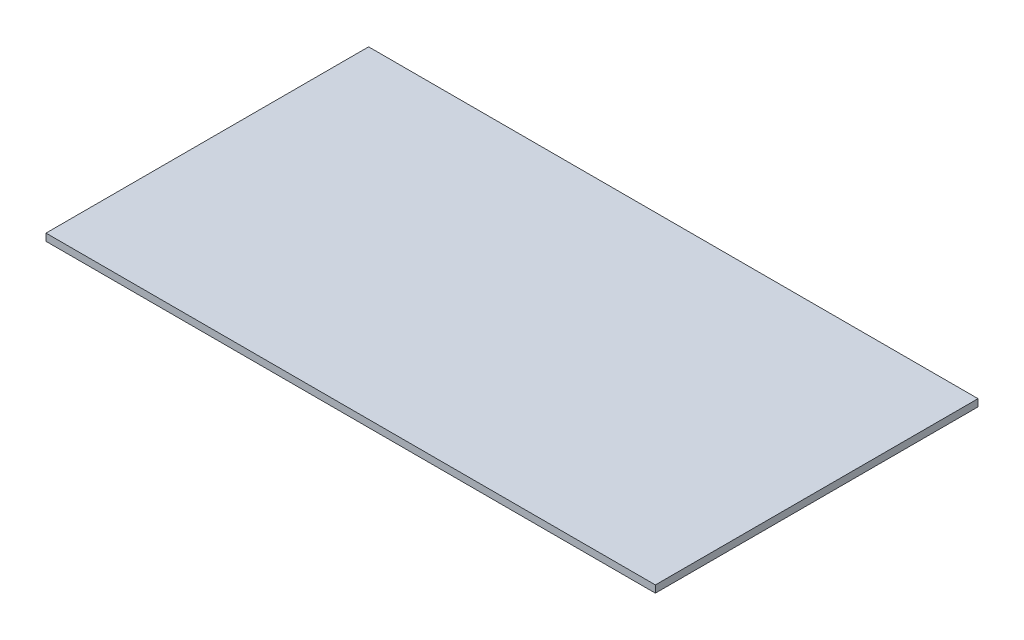
ISO-10303-21;
HEADER;
FILE_DESCRIPTION(('STEP AP214'),'2;1');
FILE_NAME('part.step','',(''),(''),'','','');
FILE_SCHEMA(('AUTOMOTIVE_DESIGN { 1 0 10303 214 1 1 1 1 }'));
ENDSEC;
DATA;
#1=APPLICATION_CONTEXT('core data for automotive mechanical design processes');
#2=APPLICATION_PROTOCOL_DEFINITION('international standard','automotive_design',2000,#1);
#3=PRODUCT_CONTEXT('',#1,'mechanical');
#4=PRODUCT('Part','Part','',(#3));
#5=PRODUCT_RELATED_PRODUCT_CATEGORY('part','',(#4));
#6=PRODUCT_DEFINITION_FORMATION('','',#4);
#7=PRODUCT_DEFINITION_CONTEXT('part definition',#1,'design');
#8=PRODUCT_DEFINITION('design','',#6,#7);
#9=PRODUCT_DEFINITION_SHAPE('','',#8);
#10=(LENGTH_UNIT() NAMED_UNIT(*) SI_UNIT(.MILLI.,.METRE.));
#11=(NAMED_UNIT(*) PLANE_ANGLE_UNIT() SI_UNIT($,.RADIAN.));
#12=(NAMED_UNIT(*) SI_UNIT($,.STERADIAN.) SOLID_ANGLE_UNIT());
#13=UNCERTAINTY_MEASURE_WITH_UNIT(LENGTH_MEASURE(1.E-05),#10,'distance_accuracy_value','');
#14=(GEOMETRIC_REPRESENTATION_CONTEXT(3) GLOBAL_UNCERTAINTY_ASSIGNED_CONTEXT((#13)) GLOBAL_UNIT_ASSIGNED_CONTEXT((#10,
#11,#12)) REPRESENTATION_CONTEXT('',''));
#15=CARTESIAN_POINT('',(0.,0.,0.));
#16=DIRECTION('',(0.,0.,1.));
#17=DIRECTION('',(1.,0.,0.));
#18=AXIS2_PLACEMENT_3D('',#15,#16,#17);
#19=CARTESIAN_POINT('',(-425.,10.,225.));
#20=DIRECTION('',(1.,0.,0.));
#21=DIRECTION('',(0.,0.,-1.));
#22=AXIS2_PLACEMENT_3D('',#19,#20,#21);
#23=PLANE('',#22);
#24=DIRECTION('',(0.,0.,1.));
#25=VECTOR('',#24,1.);
#26=CARTESIAN_POINT('',(-425.,0.,225.));
#27=LINE('',#26,#25);
#28=CARTESIAN_POINT('',(-425.,0.,-225.));
#29=VERTEX_POINT('',#28);
#30=CARTESIAN_POINT('',(-425.,0.,225.));
#31=VERTEX_POINT('',#30);
#32=EDGE_CURVE('E97',#29,#31,#27,.T.);
#33=ORIENTED_EDGE('',*,*,#32,.T.);
#34=DIRECTION('',(0.,-1.,0.));
#35=VECTOR('',#34,1.);
#36=CARTESIAN_POINT('',(-425.,10.,225.));
#37=LINE('',#36,#35);
#38=CARTESIAN_POINT('',(-425.,10.,225.));
#39=VERTEX_POINT('',#38);
#40=EDGE_CURVE('E11',#39,#31,#37,.T.);
#41=ORIENTED_EDGE('',*,*,#40,.F.);
#42=DIRECTION('',(0.,0.,1.));
#43=VECTOR('',#42,1.);
#44=CARTESIAN_POINT('',(-425.,10.,225.));
#45=LINE('',#44,#43);
#46=CARTESIAN_POINT('',(-425.,10.,-225.));
#47=VERTEX_POINT('',#46);
#48=EDGE_CURVE('E85',#47,#39,#45,.T.);
#49=ORIENTED_EDGE('',*,*,#48,.F.);
#50=DIRECTION('',(0.,-1.,0.));
#51=VECTOR('',#50,1.);
#52=CARTESIAN_POINT('',(-425.,10.,-225.));
#53=LINE('',#52,#51);
#54=EDGE_CURVE('E93',#47,#29,#53,.T.);
#55=ORIENTED_EDGE('',*,*,#54,.T.);
#56=EDGE_LOOP('',(#33,#41,#49,#55));
#57=FACE_BOUND('',#56,.T.);
#58=ADVANCED_FACE('F34',(#57),#23,.F.);
#59=CARTESIAN_POINT('',(425.,10.,225.));
#60=DIRECTION('',(0.,0.,-1.));
#61=DIRECTION('',(-1.,0.,0.));
#62=AXIS2_PLACEMENT_3D('',#59,#60,#61);
#63=PLANE('',#62);
#64=DIRECTION('',(1.,0.,0.));
#65=VECTOR('',#64,1.);
#66=CARTESIAN_POINT('',(425.,0.,225.));
#67=LINE('',#66,#65);
#68=CARTESIAN_POINT('',(425.,0.,225.));
#69=VERTEX_POINT('',#68);
#70=EDGE_CURVE('E89',#31,#69,#67,.T.);
#71=ORIENTED_EDGE('',*,*,#70,.T.);
#72=DIRECTION('',(0.,-1.,0.));
#73=VECTOR('',#72,1.);
#74=CARTESIAN_POINT('',(425.,10.,225.));
#75=LINE('',#74,#73);
#76=CARTESIAN_POINT('',(425.,10.,225.));
#77=VERTEX_POINT('',#76);
#78=EDGE_CURVE('E42',#77,#69,#75,.T.);
#79=ORIENTED_EDGE('',*,*,#78,.F.);
#80=DIRECTION('',(1.,0.,0.));
#81=VECTOR('',#80,1.);
#82=CARTESIAN_POINT('',(425.,10.,225.));
#83=LINE('',#82,#81);
#84=EDGE_CURVE('E80',#39,#77,#83,.T.);
#85=ORIENTED_EDGE('',*,*,#84,.F.);
#86=ORIENTED_EDGE('',*,*,#40,.T.);
#87=EDGE_LOOP('',(#71,#79,#85,#86));
#88=FACE_BOUND('',#87,.T.);
#89=ADVANCED_FACE('F88',(#88),#63,.F.);
#90=CARTESIAN_POINT('',(425.,10.,225.));
#91=DIRECTION('',(-1.,0.,0.));
#92=DIRECTION('',(0.,0.,1.));
#93=AXIS2_PLACEMENT_3D('',#90,#91,#92);
#94=PLANE('',#93);
#95=DIRECTION('',(0.,0.,-1.));
#96=VECTOR('',#95,1.);
#97=CARTESIAN_POINT('',(425.,0.,225.));
#98=LINE('',#97,#96);
#99=CARTESIAN_POINT('',(425.,0.,-225.));
#100=VERTEX_POINT('',#99);
#101=EDGE_CURVE('E67',#69,#100,#98,.T.);
#102=ORIENTED_EDGE('',*,*,#101,.T.);
#103=DIRECTION('',(0.,-1.,0.));
#104=VECTOR('',#103,1.);
#105=CARTESIAN_POINT('',(425.,10.,-225.));
#106=LINE('',#105,#104);
#107=CARTESIAN_POINT('',(425.,10.,-225.));
#108=VERTEX_POINT('',#107);
#109=EDGE_CURVE('E90',#108,#100,#106,.T.);
#110=ORIENTED_EDGE('',*,*,#109,.F.);
#111=DIRECTION('',(0.,0.,-1.));
#112=VECTOR('',#111,1.);
#113=CARTESIAN_POINT('',(425.,10.,225.));
#114=LINE('',#113,#112);
#115=EDGE_CURVE('E83',#77,#108,#114,.T.);
#116=ORIENTED_EDGE('',*,*,#115,.F.);
#117=ORIENTED_EDGE('',*,*,#78,.T.);
#118=EDGE_LOOP('',(#102,#110,#116,#117));
#119=FACE_BOUND('',#118,.T.);
#120=ADVANCED_FACE('F91',(#119),#94,.F.);
#121=CARTESIAN_POINT('',(425.,10.,-225.));
#122=DIRECTION('',(0.,0.,1.));
#123=DIRECTION('',(1.,0.,0.));
#124=AXIS2_PLACEMENT_3D('',#121,#122,#123);
#125=PLANE('',#124);
#126=DIRECTION('',(-1.,0.,0.));
#127=VECTOR('',#126,1.);
#128=CARTESIAN_POINT('',(425.,0.,-225.));
#129=LINE('',#128,#127);
#130=EDGE_CURVE('E73',#100,#29,#129,.T.);
#131=ORIENTED_EDGE('',*,*,#130,.T.);
#132=ORIENTED_EDGE('',*,*,#54,.F.);
#133=DIRECTION('',(-1.,0.,0.));
#134=VECTOR('',#133,1.);
#135=CARTESIAN_POINT('',(425.,10.,-225.));
#136=LINE('',#135,#134);
#137=EDGE_CURVE('E50',#108,#47,#136,.T.);
#138=ORIENTED_EDGE('',*,*,#137,.F.);
#139=ORIENTED_EDGE('',*,*,#109,.T.);
#140=EDGE_LOOP('',(#131,#132,#138,#139));
#141=FACE_BOUND('',#140,.T.);
#142=ADVANCED_FACE('F104',(#141),#125,.F.);
#143=CARTESIAN_POINT('',(0.,10.,0.));
#144=DIRECTION('',(0.,1.,0.));
#145=DIRECTION('',(0.,0.,1.));
#146=AXIS2_PLACEMENT_3D('',#143,#144,#145);
#147=PLANE('',#146);
#148=ORIENTED_EDGE('',*,*,#48,.T.);
#149=ORIENTED_EDGE('',*,*,#84,.T.);
#150=ORIENTED_EDGE('',*,*,#115,.T.);
#151=ORIENTED_EDGE('',*,*,#137,.T.);
#152=EDGE_LOOP('',(#148,#149,#150,#151));
#153=FACE_BOUND('',#152,.T.);
#154=ADVANCED_FACE('F81',(#153),#147,.T.);
#155=CARTESIAN_POINT('',(0.,0.,0.));
#156=DIRECTION('',(0.,1.,0.));
#157=DIRECTION('',(0.,0.,1.));
#158=AXIS2_PLACEMENT_3D('',#155,#156,#157);
#159=PLANE('',#158);
#160=ORIENTED_EDGE('',*,*,#32,.F.);
#161=ORIENTED_EDGE('',*,*,#130,.F.);
#162=ORIENTED_EDGE('',*,*,#101,.F.);
#163=ORIENTED_EDGE('',*,*,#70,.F.);
#164=EDGE_LOOP('',(#160,#161,#162,#163));
#165=FACE_BOUND('',#164,.T.);
#166=ADVANCED_FACE('F107',(#165),#159,.F.);
#167=CLOSED_SHELL('',(#58,#89,#120,#142,#154,#166));
#168=MANIFOLD_SOLID_BREP('B2',#167);
#169=ADVANCED_BREP_SHAPE_REPRESENTATION('',(#18,#168),#14);
#170=SHAPE_DEFINITION_REPRESENTATION(#9,#169);
ENDSEC;
END-ISO-10303-21;
